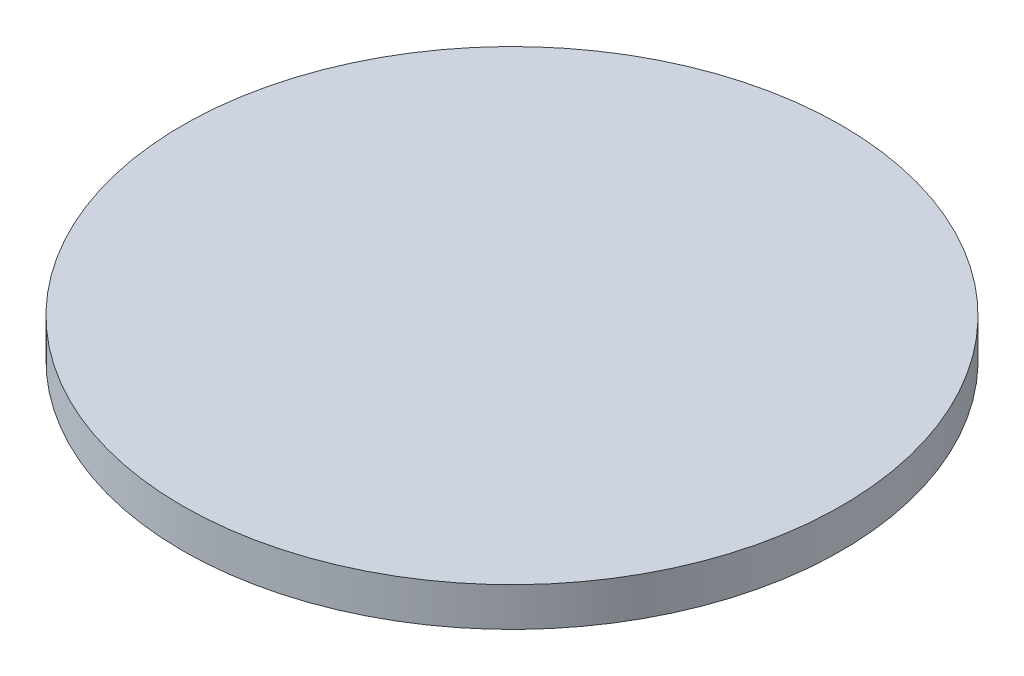
ISO-10303-21;
HEADER;
FILE_DESCRIPTION(('STEP AP214'),'2;1');
FILE_NAME('part.step','',(''),(''),'','','');
FILE_SCHEMA(('AUTOMOTIVE_DESIGN { 1 0 10303 214 1 1 1 1 }'));
ENDSEC;
DATA;
#1=APPLICATION_CONTEXT('core data for automotive mechanical design processes');
#2=APPLICATION_PROTOCOL_DEFINITION('international standard','automotive_design',2000,#1);
#3=PRODUCT_CONTEXT('',#1,'mechanical');
#4=PRODUCT('Part','Part','',(#3));
#5=PRODUCT_RELATED_PRODUCT_CATEGORY('part','',(#4));
#6=PRODUCT_DEFINITION_FORMATION('','',#4);
#7=PRODUCT_DEFINITION_CONTEXT('part definition',#1,'design');
#8=PRODUCT_DEFINITION('design','',#6,#7);
#9=PRODUCT_DEFINITION_SHAPE('','',#8);
#10=(LENGTH_UNIT() NAMED_UNIT(*) SI_UNIT(.MILLI.,.METRE.));
#11=(NAMED_UNIT(*) PLANE_ANGLE_UNIT() SI_UNIT($,.RADIAN.));
#12=(NAMED_UNIT(*) SI_UNIT($,.STERADIAN.) SOLID_ANGLE_UNIT());
#13=UNCERTAINTY_MEASURE_WITH_UNIT(LENGTH_MEASURE(1.E-05),#10,'distance_accuracy_value','');
#14=(GEOMETRIC_REPRESENTATION_CONTEXT(3) GLOBAL_UNCERTAINTY_ASSIGNED_CONTEXT((#13)) GLOBAL_UNIT_ASSIGNED_CONTEXT((#10,
#11,#12)) REPRESENTATION_CONTEXT('',''));
#15=CARTESIAN_POINT('',(0.,0.,0.));
#16=DIRECTION('',(0.,0.,1.));
#17=DIRECTION('',(1.,0.,0.));
#18=AXIS2_PLACEMENT_3D('',#15,#16,#17);
#19=CARTESIAN_POINT('',(350.,910.,-280.));
#20=DIRECTION('',(0.,-1.,0.));
#21=DIRECTION('',(0.,0.,-1.));
#22=AXIS2_PLACEMENT_3D('',#19,#20,#21);
#23=CYLINDRICAL_SURFACE('',#22,170.);
#24=CARTESIAN_POINT('',(350.,910.,-280.));
#25=DIRECTION('',(0.,1.,0.));
#26=DIRECTION('',(0.,0.,1.));
#27=AXIS2_PLACEMENT_3D('',#24,#25,#26);
#28=CIRCLE('',#27,170.);
#29=CARTESIAN_POINT('',(350.,910.,-110.));
#30=VERTEX_POINT('',#29);
#31=EDGE_CURVE('E10',#30,#30,#28,.T.);
#32=ORIENTED_EDGE('',*,*,#31,.F.);
#33=EDGE_LOOP('',(#32));
#34=FACE_BOUND('',#33,.T.);
#35=CARTESIAN_POINT('',(350.,890.,-280.));
#36=DIRECTION('',(0.,1.,0.));
#37=DIRECTION('',(0.,0.,1.));
#38=AXIS2_PLACEMENT_3D('',#35,#36,#37);
#39=CIRCLE('',#38,170.);
#40=CARTESIAN_POINT('',(350.,890.,-110.));
#41=VERTEX_POINT('',#40);
#42=EDGE_CURVE('E40',#41,#41,#39,.T.);
#43=ORIENTED_EDGE('',*,*,#42,.T.);
#44=EDGE_LOOP('',(#43));
#45=FACE_BOUND('',#44,.T.);
#46=ADVANCED_FACE('F37',(#34,#45),#23,.T.);
#47=CARTESIAN_POINT('',(350.,910.,-280.));
#48=DIRECTION('',(0.,1.,0.));
#49=DIRECTION('',(0.,0.,1.));
#50=AXIS2_PLACEMENT_3D('',#47,#48,#49);
#51=PLANE('',#50);
#52=ORIENTED_EDGE('',*,*,#31,.T.);
#53=EDGE_LOOP('',(#52));
#54=FACE_BOUND('',#53,.T.);
#55=ADVANCED_FACE('F52',(#54),#51,.T.);
#56=CARTESIAN_POINT('',(350.,890.,-280.));
#57=DIRECTION('',(0.,1.,0.));
#58=DIRECTION('',(0.,0.,1.));
#59=AXIS2_PLACEMENT_3D('',#56,#57,#58);
#60=PLANE('',#59);
#61=ORIENTED_EDGE('',*,*,#42,.F.);
#62=EDGE_LOOP('',(#61));
#63=FACE_BOUND('',#62,.T.);
#64=ADVANCED_FACE('F50',(#63),#60,.F.);
#65=CLOSED_SHELL('',(#46,#55,#64));
#66=MANIFOLD_SOLID_BREP('B2',#65);
#67=ADVANCED_BREP_SHAPE_REPRESENTATION('',(#18,#66),#14);
#68=SHAPE_DEFINITION_REPRESENTATION(#9,#67);
ENDSEC;
END-ISO-10303-21;
